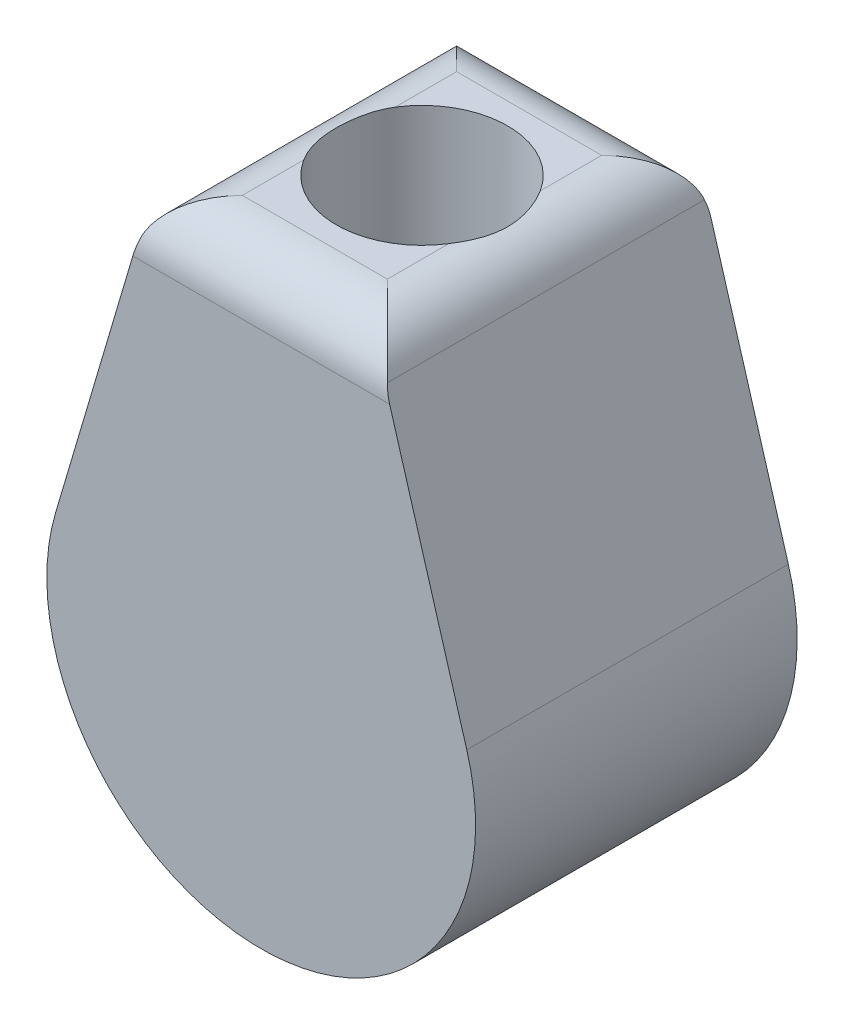
ISO-10303-21;
HEADER;
FILE_DESCRIPTION(('STEP AP214'),'2;1');
FILE_NAME('part.step','',(''),(''),'','','');
FILE_SCHEMA(('AUTOMOTIVE_DESIGN { 1 0 10303 214 1 1 1 1 }'));
ENDSEC;
DATA;
#1=APPLICATION_CONTEXT('core data for automotive mechanical design processes');
#2=APPLICATION_PROTOCOL_DEFINITION('international standard','automotive_design',2000,#1);
#3=PRODUCT_CONTEXT('',#1,'mechanical');
#4=PRODUCT('Part','Part','',(#3));
#5=PRODUCT_RELATED_PRODUCT_CATEGORY('part','',(#4));
#6=PRODUCT_DEFINITION_FORMATION('','',#4);
#7=PRODUCT_DEFINITION_CONTEXT('part definition',#1,'design');
#8=PRODUCT_DEFINITION('design','',#6,#7);
#9=PRODUCT_DEFINITION_SHAPE('','',#8);
#10=(LENGTH_UNIT() NAMED_UNIT(*) SI_UNIT(.MILLI.,.METRE.));
#11=(NAMED_UNIT(*) PLANE_ANGLE_UNIT() SI_UNIT($,.RADIAN.));
#12=(NAMED_UNIT(*) SI_UNIT($,.STERADIAN.) SOLID_ANGLE_UNIT());
#13=UNCERTAINTY_MEASURE_WITH_UNIT(LENGTH_MEASURE(1.E-05),#10,'distance_accuracy_value','');
#14=(GEOMETRIC_REPRESENTATION_CONTEXT(3) GLOBAL_UNCERTAINTY_ASSIGNED_CONTEXT((#13)) GLOBAL_UNIT_ASSIGNED_CONTEXT((#10,
#11,#12)) REPRESENTATION_CONTEXT('',''));
#15=CARTESIAN_POINT('',(0.,0.,0.));
#16=DIRECTION('',(0.,0.,1.));
#17=DIRECTION('',(1.,0.,0.));
#18=AXIS2_PLACEMENT_3D('',#15,#16,#17);
#19=CARTESIAN_POINT('',(1.6,0.,-6.));
#20=DIRECTION('',(0.,-1.,0.));
#21=DIRECTION('',(1.,0.,0.));
#22=AXIS2_PLACEMENT_3D('',#19,#20,#21);
#23=PLANE('',#22);
#24=DIRECTION('',(-1.,0.,0.));
#25=VECTOR('',#24,1.);
#26=CARTESIAN_POINT('',(2.1,0.,-5.));
#27=LINE('',#26,#25);
#28=CARTESIAN_POINT('',(-1.35305713878644,0.,-5.));
#29=VERTEX_POINT('',#28);
#30=CARTESIAN_POINT('',(1.35305713878644,0.,-5.));
#31=VERTEX_POINT('',#30);
#32=EDGE_CURVE('E182',#29,#31,#27,.F.);
#33=ORIENTED_EDGE('',*,*,#32,.F.);
#34=DIRECTION('',(0.,0.,1.));
#35=VECTOR('',#34,1.);
#36=CARTESIAN_POINT('',(-1.35305713878644,0.,-6.));
#37=LINE('',#36,#35);
#38=CARTESIAN_POINT('',(-1.35305713878644,0.,-3.85395338232193));
#39=VERTEX_POINT('',#38);
#40=EDGE_CURVE('E179',#39,#29,#37,.F.);
#41=ORIENTED_EDGE('',*,*,#40,.F.);
#42=CARTESIAN_POINT('',(0.,0.,-3.));
#43=DIRECTION('',(0.,1.,0.));
#44=DIRECTION('',(1.,0.,0.));
#45=AXIS2_PLACEMENT_3D('',#42,#43,#44);
#46=CIRCLE('',#45,1.6);
#47=CARTESIAN_POINT('',(1.35305713878644,0.,-3.85395338232193));
#48=VERTEX_POINT('',#47);
#49=EDGE_CURVE('E160',#48,#39,#46,.T.);
#50=ORIENTED_EDGE('',*,*,#49,.F.);
#51=DIRECTION('',(0.,0.,1.));
#52=VECTOR('',#51,1.);
#53=CARTESIAN_POINT('',(1.35305713878644,0.,-6.));
#54=LINE('',#53,#52);
#55=EDGE_CURVE('E184',#31,#48,#54,.T.);
#56=ORIENTED_EDGE('',*,*,#55,.F.);
#57=EDGE_LOOP('',(#33,#41,#50,#56));
#58=FACE_BOUND('',#57,.T.);
#59=ADVANCED_FACE('F43',(#58),#23,.F.);
#60=CARTESIAN_POINT('',(-1.6,-8.,-6.));
#61=DIRECTION('',(0.,-1.,0.));
#62=DIRECTION('',(0.,0.,1.));
#63=AXIS2_PLACEMENT_3D('',#60,#61,#62);
#64=PLANE('',#63);
#65=CARTESIAN_POINT('',(0.,-8.,-3.));
#66=DIRECTION('',(0.,-1.,0.));
#67=DIRECTION('',(0.,0.,-1.));
#68=AXIS2_PLACEMENT_3D('',#65,#66,#67);
#69=CIRCLE('',#68,1.6);
#70=CARTESIAN_POINT('',(0.,-8.,-4.6));
#71=VERTEX_POINT('',#70);
#72=EDGE_CURVE('E154',#71,#71,#69,.T.);
#73=ORIENTED_EDGE('',*,*,#72,.F.);
#74=EDGE_LOOP('',(#73));
#75=FACE_BOUND('',#74,.T.);
#76=ADVANCED_FACE('F221',(#75),#64,.F.);
#77=CARTESIAN_POINT('',(-2.1,0.,-6.));
#78=DIRECTION('',(0.958895343820342,-0.283759968282469,0.));
#79=DIRECTION('',(0.283759968282469,0.958895343820342,0.));
#80=AXIS2_PLACEMENT_3D('',#77,#78,#79);
#81=PLANE('',#80);
#82=DIRECTION('',(-0.283759968282469,-0.958895343820342,0.));
#83=VECTOR('',#82,1.);
#84=CARTESIAN_POINT('',(-2.1,0.,-6.));
#85=LINE('',#84,#83);
#86=CARTESIAN_POINT('',(-2.39592381495142,-0.999999999999999,-6.));
#87=VERTEX_POINT('',#86);
#88=CARTESIAN_POINT('',(-3.83558137528137,-5.86496012687012,-6.));
#89=VERTEX_POINT('',#88);
#90=EDGE_CURVE('E126',#87,#89,#85,.T.);
#91=ORIENTED_EDGE('',*,*,#90,.T.);
#92=DIRECTION('',(0.,0.,1.));
#93=VECTOR('',#92,1.);
#94=CARTESIAN_POINT('',(-3.83558137528137,-5.86496012687012,-6.));
#95=LINE('',#94,#93);
#96=CARTESIAN_POINT('',(-3.83558137528137,-5.86496012687012,0.));
#97=VERTEX_POINT('',#96);
#98=EDGE_CURVE('E134',#89,#97,#95,.T.);
#99=ORIENTED_EDGE('',*,*,#98,.T.);
#100=DIRECTION('',(-0.283759968282469,-0.958895343820342,0.));
#101=VECTOR('',#100,1.);
#102=CARTESIAN_POINT('',(-2.1,0.,0.));
#103=LINE('',#102,#101);
#104=CARTESIAN_POINT('',(-2.39592381495142,-1.,0.));
#105=VERTEX_POINT('',#104);
#106=EDGE_CURVE('E158',#105,#97,#103,.T.);
#107=ORIENTED_EDGE('',*,*,#106,.F.);
#108=CARTESIAN_POINT('',(-2.39592381495142,-1.,-1.));
#109=DIRECTION('',(-0.958895343820342,0.283759968282469,0.));
#110=DIRECTION('',(-0.283759968282469,-0.958895343820342,0.));
#111=AXIS2_PLACEMENT_3D('',#108,#109,#110);
#112=ELLIPSE('',#111,1.04286667616498,1.);
#113=CARTESIAN_POINT('',(-2.31195248260678,-0.716240031717531,-0.0411046561796576));
#114=VERTEX_POINT('',#113);
#115=EDGE_CURVE('E164',#114,#105,#112,.F.);
#116=ORIENTED_EDGE('',*,*,#115,.F.);
#117=DIRECTION('',(0.,0.,1.));
#118=VECTOR('',#117,1.);
#119=CARTESIAN_POINT('',(-2.31195248260678,-0.716240031717531,-6.));
#120=LINE('',#119,#118);
#121=CARTESIAN_POINT('',(-2.31195248260678,-0.716240031717531,-5.95889534382034));
#122=VERTEX_POINT('',#121);
#123=EDGE_CURVE('E167',#122,#114,#120,.T.);
#124=ORIENTED_EDGE('',*,*,#123,.F.);
#125=CARTESIAN_POINT('',(-2.39592381495142,-0.999999999999999,-5.));
#126=DIRECTION('',(-0.958895343820342,0.283759968282469,0.));
#127=DIRECTION('',(0.283759968282469,0.958895343820342,0.));
#128=AXIS2_PLACEMENT_3D('',#125,#126,#127);
#129=ELLIPSE('',#128,1.04286667616498,1.);
#130=EDGE_CURVE('E148',#87,#122,#129,.F.);
#131=ORIENTED_EDGE('',*,*,#130,.F.);
#132=EDGE_LOOP('',(#91,#99,#107,#116,#124,#131));
#133=FACE_BOUND('',#132,.T.);
#134=ADVANCED_FACE('F145',(#133),#81,.F.);
#135=CARTESIAN_POINT('',(0.,-7.,-6.));
#136=DIRECTION('',(0.,0.,1.));
#137=DIRECTION('',(-1.,0.,0.));
#138=AXIS2_PLACEMENT_3D('',#135,#136,#137);
#139=CYLINDRICAL_SURFACE('',#138,4.);
#140=CARTESIAN_POINT('',(0.,-7.,0.));
#141=DIRECTION('',(0.,0.,1.));
#142=DIRECTION('',(1.,0.,0.));
#143=AXIS2_PLACEMENT_3D('',#140,#141,#142);
#144=CIRCLE('',#143,4.);
#145=CARTESIAN_POINT('',(3.83558137528137,-5.86496012687012,0.));
#146=VERTEX_POINT('',#145);
#147=EDGE_CURVE('E137',#97,#146,#144,.T.);
#148=ORIENTED_EDGE('',*,*,#147,.F.);
#149=ORIENTED_EDGE('',*,*,#98,.F.);
#150=CARTESIAN_POINT('',(0.,-7.,-6.));
#151=DIRECTION('',(0.,0.,1.));
#152=DIRECTION('',(1.,0.,0.));
#153=AXIS2_PLACEMENT_3D('',#150,#151,#152);
#154=CIRCLE('',#153,4.);
#155=CARTESIAN_POINT('',(3.83558137528137,-5.86496012687012,-6.));
#156=VERTEX_POINT('',#155);
#157=EDGE_CURVE('E122',#89,#156,#154,.T.);
#158=ORIENTED_EDGE('',*,*,#157,.T.);
#159=DIRECTION('',(0.,0.,1.));
#160=VECTOR('',#159,1.);
#161=CARTESIAN_POINT('',(3.83558137528137,-5.86496012687012,-6.));
#162=LINE('',#161,#160);
#163=EDGE_CURVE('E142',#156,#146,#162,.T.);
#164=ORIENTED_EDGE('',*,*,#163,.T.);
#165=EDGE_LOOP('',(#148,#149,#158,#164));
#166=FACE_BOUND('',#165,.T.);
#167=ADVANCED_FACE('F135',(#166),#139,.T.);
#168=CARTESIAN_POINT('',(2.1,0.,-6.));
#169=DIRECTION('',(-0.958895343820342,-0.283759968282469,0.));
#170=DIRECTION('',(0.283759968282469,-0.958895343820342,0.));
#171=AXIS2_PLACEMENT_3D('',#168,#169,#170);
#172=PLANE('',#171);
#173=DIRECTION('',(0.,0.,1.));
#174=VECTOR('',#173,1.);
#175=CARTESIAN_POINT('',(2.31195248260678,-0.71624003171753,-6.));
#176=LINE('',#175,#174);
#177=CARTESIAN_POINT('',(2.31195248260678,-0.71624003171753,-0.0411046561796576));
#178=VERTEX_POINT('',#177);
#179=CARTESIAN_POINT('',(2.31195248260678,-0.71624003171753,-5.95889534382034));
#180=VERTEX_POINT('',#179);
#181=EDGE_CURVE('E189',#178,#180,#176,.F.);
#182=ORIENTED_EDGE('',*,*,#181,.F.);
#183=CARTESIAN_POINT('',(2.39592381495142,-1.,-1.));
#184=DIRECTION('',(0.958895343820342,0.283759968282469,0.));
#185=DIRECTION('',(-0.283759968282469,0.958895343820342,0.));
#186=AXIS2_PLACEMENT_3D('',#183,#184,#185);
#187=ELLIPSE('',#186,1.04286667616498,1.);
#188=CARTESIAN_POINT('',(2.39592381495142,-1.,0.));
#189=VERTEX_POINT('',#188);
#190=EDGE_CURVE('E187',#189,#178,#187,.F.);
#191=ORIENTED_EDGE('',*,*,#190,.F.);
#192=DIRECTION('',(-0.283759968282469,0.958895343820342,0.));
#193=VECTOR('',#192,1.);
#194=CARTESIAN_POINT('',(2.1,0.,0.));
#195=LINE('',#194,#193);
#196=EDGE_CURVE('E149',#146,#189,#195,.T.);
#197=ORIENTED_EDGE('',*,*,#196,.F.);
#198=ORIENTED_EDGE('',*,*,#163,.F.);
#199=DIRECTION('',(-0.283759968282469,0.958895343820342,0.));
#200=VECTOR('',#199,1.);
#201=CARTESIAN_POINT('',(2.1,0.,-6.));
#202=LINE('',#201,#200);
#203=CARTESIAN_POINT('',(2.39592381495142,-0.999999999999999,-6.));
#204=VERTEX_POINT('',#203);
#205=EDGE_CURVE('E128',#156,#204,#202,.T.);
#206=ORIENTED_EDGE('',*,*,#205,.T.);
#207=CARTESIAN_POINT('',(2.39592381495142,-0.999999999999999,-5.));
#208=DIRECTION('',(0.958895343820342,0.283759968282469,0.));
#209=DIRECTION('',(0.283759968282469,-0.958895343820342,0.));
#210=AXIS2_PLACEMENT_3D('',#207,#208,#209);
#211=ELLIPSE('',#210,1.04286667616498,1.);
#212=EDGE_CURVE('E191',#180,#204,#211,.F.);
#213=ORIENTED_EDGE('',*,*,#212,.F.);
#214=EDGE_LOOP('',(#182,#191,#197,#198,#206,#213));
#215=FACE_BOUND('',#214,.T.);
#216=ADVANCED_FACE('F227',(#215),#172,.F.);
#217=CARTESIAN_POINT('',(-1.35305713878644,0.,-2.14604661767807));
#218=VERTEX_POINT('',#217);
#219=CARTESIAN_POINT('',(1.35305713878644,0.,-2.14604661767807));
#220=VERTEX_POINT('',#219);
#221=EDGE_CURVE('E257',#218,#220,#46,.T.);
#222=ORIENTED_EDGE('',*,*,#221,.F.);
#223=DIRECTION('',(0.,0.,1.));
#224=VECTOR('',#223,1.);
#225=CARTESIAN_POINT('',(-1.35305713878644,0.,-6.));
#226=LINE('',#225,#224);
#227=CARTESIAN_POINT('',(-1.35305713878644,0.,-1.));
#228=VERTEX_POINT('',#227);
#229=EDGE_CURVE('E174',#228,#218,#226,.F.);
#230=ORIENTED_EDGE('',*,*,#229,.F.);
#231=DIRECTION('',(-1.,0.,0.));
#232=VECTOR('',#231,1.);
#233=CARTESIAN_POINT('',(1.6,0.,-1.));
#234=LINE('',#233,#232);
#235=CARTESIAN_POINT('',(1.35305713878644,0.,-1.));
#236=VERTEX_POINT('',#235);
#237=EDGE_CURVE('E171',#236,#228,#234,.T.);
#238=ORIENTED_EDGE('',*,*,#237,.F.);
#239=DIRECTION('',(0.,0.,1.));
#240=VECTOR('',#239,1.);
#241=CARTESIAN_POINT('',(1.35305713878644,0.,-6.));
#242=LINE('',#241,#240);
#243=EDGE_CURVE('E177',#220,#236,#242,.T.);
#244=ORIENTED_EDGE('',*,*,#243,.F.);
#245=EDGE_LOOP('',(#222,#230,#238,#244));
#246=FACE_BOUND('',#245,.T.);
#247=ADVANCED_FACE('F217',(#246),#23,.F.);
#248=CARTESIAN_POINT('',(0.,-7.,-6.));
#249=DIRECTION('',(0.,0.,-1.));
#250=DIRECTION('',(1.,0.,0.));
#251=AXIS2_PLACEMENT_3D('',#248,#249,#250);
#252=PLANE('',#251);
#253=ORIENTED_EDGE('',*,*,#205,.F.);
#254=ORIENTED_EDGE('',*,*,#157,.F.);
#255=ORIENTED_EDGE('',*,*,#90,.F.);
#256=DIRECTION('',(-1.,0.,0.));
#257=VECTOR('',#256,1.);
#258=CARTESIAN_POINT('',(-2.1,-0.999999999999999,-6.));
#259=LINE('',#258,#257);
#260=EDGE_CURVE('E141',#204,#87,#259,.T.);
#261=ORIENTED_EDGE('',*,*,#260,.F.);
#262=EDGE_LOOP('',(#253,#254,#255,#261));
#263=FACE_BOUND('',#262,.T.);
#264=ADVANCED_FACE('F124',(#263),#252,.T.);
#265=CARTESIAN_POINT('',(0.,-7.,0.));
#266=DIRECTION('',(0.,0.,-1.));
#267=DIRECTION('',(1.,0.,0.));
#268=AXIS2_PLACEMENT_3D('',#265,#266,#267);
#269=PLANE('',#268);
#270=ORIENTED_EDGE('',*,*,#106,.T.);
#271=ORIENTED_EDGE('',*,*,#147,.T.);
#272=ORIENTED_EDGE('',*,*,#196,.T.);
#273=DIRECTION('',(-1.,0.,0.));
#274=VECTOR('',#273,1.);
#275=CARTESIAN_POINT('',(0.,-0.999999999999999,0.));
#276=LINE('',#275,#274);
#277=EDGE_CURVE('E11',#105,#189,#276,.F.);
#278=ORIENTED_EDGE('',*,*,#277,.F.);
#279=EDGE_LOOP('',(#270,#271,#272,#278));
#280=FACE_BOUND('',#279,.T.);
#281=ADVANCED_FACE('F212',(#280),#269,.F.);
#282=CARTESIAN_POINT('',(0.,4.38634243989226,-3.));
#283=DIRECTION('',(0.,-1.,0.));
#284=DIRECTION('',(1.,0.,0.));
#285=AXIS2_PLACEMENT_3D('',#282,#283,#284);
#286=CYLINDRICAL_SURFACE('',#285,1.6);
#287=ORIENTED_EDGE('',*,*,#72,.T.);
#288=EDGE_LOOP('',(#287));
#289=FACE_BOUND('',#288,.T.);
#290=ORIENTED_EDGE('',*,*,#49,.T.);
#291=CARTESIAN_POINT('',(-1.35305713878644,0.,-2.14604661767807));
#292=CARTESIAN_POINT('',(-1.37570076684839,-9.53045621538372E-06,-2.18191839411649));
#293=CARTESIAN_POINT('',(-1.39690325497435,-0.000768999835214666,-2.21867998604224));
#294=CARTESIAN_POINT('',(-1.43630612484967,-0.00327337720027648,-2.29372981080483));
#295=CARTESIAN_POINT('',(-1.45450769550025,-0.00501789371318155,-2.33201743155932));
#296=CARTESIAN_POINT('',(-1.48781856953981,-0.00898011825730303,-2.40992209650369));
#297=CARTESIAN_POINT('',(-1.50292572784003,-0.0111981523766961,-2.44954004089661));
#298=CARTESIAN_POINT('',(-1.52994996539505,-0.0156756536905785,-2.52984003475307));
#299=CARTESIAN_POINT('',(-1.54186668252565,-0.0179351255572981,-2.57052220443446));
#300=CARTESIAN_POINT('',(-1.57363344648718,-0.0243736893075423,-2.6975140532573));
#301=CARTESIAN_POINT('',(-1.58800640288033,-0.0279663233590616,-2.785303918922));
#302=CARTESIAN_POINT('',(-1.60200351015844,-0.0314551515525887,-2.96203672031867));
#303=CARTESIAN_POINT('',(-1.6016377776277,-0.0313538811821458,-3.05097882324095));
#304=CARTESIAN_POINT('',(-1.58627621511469,-0.0275461471660554,-3.22687845890373));
#305=CARTESIAN_POINT('',(-1.57138010864585,-0.0238642582106822,-3.3138453857703));
#306=CARTESIAN_POINT('',(-1.52754259715676,-0.0150897084323437,-3.48407570744627));
#307=CARTESIAN_POINT('',(-1.49860837489121,-0.00999776964800421,-3.56734097249317));
#308=CARTESIAN_POINT('',(-1.4472665877008,-0.00432313828283832,-3.68333513020168));
#309=CARTESIAN_POINT('',(-1.43016476450946,-0.0028069553516254,-3.71843842241768));
#310=CARTESIAN_POINT('',(-1.39346474108047,-0.000648485603974057,-3.78725624318838));
#311=CARTESIAN_POINT('',(-1.37387128799555,-4.56341899608802E-06,-3.82097325536864));
#312=CARTESIAN_POINT('',(-1.35305713878644,0.,-3.85395338232193));
#313=B_SPLINE_CURVE_WITH_KNOTS('',3,(#291,#292,#293,#294,#295,#296,#297,#298,#299,#300,#301,
#302,#303,#304,#305,#306,#307,#308,#309,#310,#311,#312),.UNSPECIFIED.,.F.,.F.,(4,2,2,2,2,2,2,2,
2,2,4),(0.,0.127198127402648,0.254345739820157,0.381581196602571,0.508831088856911,
0.774544493581811,1.04007551666759,1.30379690204821,1.56738349358779,1.68451923399984,
1.80143505568337),.UNSPECIFIED.);
#314=EDGE_CURVE('E193',#218,#39,#313,.T.);
#315=ORIENTED_EDGE('',*,*,#314,.F.);
#316=ORIENTED_EDGE('',*,*,#221,.T.);
#317=CARTESIAN_POINT('',(1.35305713878644,0.,-3.85395338232193));
#318=CARTESIAN_POINT('',(1.37570076684839,-9.53045621501494E-06,-3.81808160588351));
#319=CARTESIAN_POINT('',(1.39690325497435,-0.000768999835214293,-3.78132001395776));
#320=CARTESIAN_POINT('',(1.43630612484967,-0.0032733772002761,-3.70627018919517));
#321=CARTESIAN_POINT('',(1.45450769550025,-0.00501789371318118,-3.66798256844068));
#322=CARTESIAN_POINT('',(1.48781856953981,-0.00898011825730259,-3.59007790349631));
#323=CARTESIAN_POINT('',(1.50292572784003,-0.0111981523766956,-3.55045995910339));
#324=CARTESIAN_POINT('',(1.52994996539505,-0.0156756536905779,-3.47015996524693));
#325=CARTESIAN_POINT('',(1.54186668252565,-0.0179351255572976,-3.42947779556554));
#326=CARTESIAN_POINT('',(1.57363344648718,-0.0243736893075418,-3.3024859467427));
#327=CARTESIAN_POINT('',(1.58800640288033,-0.027966323359061,-3.214696081078));
#328=CARTESIAN_POINT('',(1.60200351015844,-0.031455151552588,-3.03796327968133));
#329=CARTESIAN_POINT('',(1.6016377776277,-0.031353881182145,-2.94902117675904));
#330=CARTESIAN_POINT('',(1.58627621511468,-0.0275461471660546,-2.77312154109627));
#331=CARTESIAN_POINT('',(1.57138010864585,-0.0238642582106814,-2.6861546142297));
#332=CARTESIAN_POINT('',(1.52754259715676,-0.0150897084323428,-2.51592429255373));
#333=CARTESIAN_POINT('',(1.49860837489121,-0.00999776964800334,-2.43265902750683));
#334=CARTESIAN_POINT('',(1.4472665877008,-0.00432313828283756,-2.31666486979832));
#335=CARTESIAN_POINT('',(1.43016476450945,-0.0028069553516247,-2.28156157758232));
#336=CARTESIAN_POINT('',(1.39346474108047,-0.000648485603973461,-2.21274375681162));
#337=CARTESIAN_POINT('',(1.37387128799555,-4.56341899554579E-06,-2.17902674463136));
#338=CARTESIAN_POINT('',(1.35305713878644,0.,-2.14604661767807));
#339=B_SPLINE_CURVE_WITH_KNOTS('',3,(#317,#318,#319,#320,#321,#322,#323,#324,#325,#326,#327,
#328,#329,#330,#331,#332,#333,#334,#335,#336,#337,#338),.UNSPECIFIED.,.F.,.F.,(4,2,2,2,2,2,2,2,
2,2,4),(0.,0.127198127402648,0.254345739820157,0.381581196602572,0.508831088856912,
0.774544493581811,1.04007551666759,1.30379690204821,1.56738349358779,1.68451923399984,
1.80143505568336),.UNSPECIFIED.);
#340=EDGE_CURVE('E52',#48,#220,#339,.T.);
#341=ORIENTED_EDGE('',*,*,#340,.F.);
#342=EDGE_LOOP('',(#290,#315,#316,#341));
#343=FACE_BOUND('',#342,.T.);
#344=ADVANCED_FACE('F208',(#289,#343),#286,.F.);
#345=CARTESIAN_POINT('',(1.6,-1.,-1.));
#346=DIRECTION('',(-1.,0.,0.));
#347=DIRECTION('',(0.,-1.,0.));
#348=AXIS2_PLACEMENT_3D('',#345,#346,#347);
#349=CYLINDRICAL_SURFACE('',#348,1.);
#350=CARTESIAN_POINT('',(-1.35305713878644,-1.,-1.));
#351=DIRECTION('',(0.707106781186548,0.,0.707106781186547));
#352=DIRECTION('',(-0.707106781186548,0.,0.707106781186547));
#353=AXIS2_PLACEMENT_3D('',#350,#351,#352);
#354=ELLIPSE('',#353,1.41421356237309,1.);
#355=EDGE_CURVE('E260',#228,#114,#354,.T.);
#356=ORIENTED_EDGE('',*,*,#355,.T.);
#357=ORIENTED_EDGE('',*,*,#115,.T.);
#358=ORIENTED_EDGE('',*,*,#277,.T.);
#359=ORIENTED_EDGE('',*,*,#190,.T.);
#360=CARTESIAN_POINT('',(1.35305713878644,-1.,-1.));
#361=DIRECTION('',(0.707106781186548,0.,-0.707106781186547));
#362=DIRECTION('',(-0.707106781186548,0.,-0.707106781186547));
#363=AXIS2_PLACEMENT_3D('',#360,#361,#362);
#364=ELLIPSE('',#363,1.41421356237309,1.);
#365=EDGE_CURVE('E47',#178,#236,#364,.F.);
#366=ORIENTED_EDGE('',*,*,#365,.T.);
#367=ORIENTED_EDGE('',*,*,#237,.T.);
#368=EDGE_LOOP('',(#356,#357,#358,#359,#366,#367));
#369=FACE_BOUND('',#368,.T.);
#370=ADVANCED_FACE('F45',(#369),#349,.T.);
#371=CARTESIAN_POINT('',(1.35305713878644,-1.,-6.));
#372=DIRECTION('',(0.,0.,1.));
#373=DIRECTION('',(-1.,0.,0.));
#374=AXIS2_PLACEMENT_3D('',#371,#372,#373);
#375=CYLINDRICAL_SURFACE('',#374,1.);
#376=ORIENTED_EDGE('',*,*,#340,.T.);
#377=ORIENTED_EDGE('',*,*,#243,.T.);
#378=ORIENTED_EDGE('',*,*,#365,.F.);
#379=ORIENTED_EDGE('',*,*,#181,.T.);
#380=CARTESIAN_POINT('',(1.35305713878644,-0.999999999999999,-5.));
#381=DIRECTION('',(-0.707106781186548,0.,-0.707106781186547));
#382=DIRECTION('',(-0.707106781186548,0.,0.707106781186547));
#383=AXIS2_PLACEMENT_3D('',#380,#381,#382);
#384=ELLIPSE('',#383,1.41421356237309,1.);
#385=EDGE_CURVE('E60',#180,#31,#384,.F.);
#386=ORIENTED_EDGE('',*,*,#385,.T.);
#387=ORIENTED_EDGE('',*,*,#55,.T.);
#388=EDGE_LOOP('',(#376,#377,#378,#379,#386,#387));
#389=FACE_BOUND('',#388,.T.);
#390=ADVANCED_FACE('F240',(#389),#375,.T.);
#391=CARTESIAN_POINT('',(-1.35305713878644,-1.,-6.));
#392=DIRECTION('',(0.,0.,1.));
#393=DIRECTION('',(-1.,0.,0.));
#394=AXIS2_PLACEMENT_3D('',#391,#392,#393);
#395=CYLINDRICAL_SURFACE('',#394,1.);
#396=ORIENTED_EDGE('',*,*,#355,.F.);
#397=ORIENTED_EDGE('',*,*,#229,.T.);
#398=ORIENTED_EDGE('',*,*,#314,.T.);
#399=ORIENTED_EDGE('',*,*,#40,.T.);
#400=CARTESIAN_POINT('',(-1.35305713878644,-1.,-5.));
#401=DIRECTION('',(0.707106781186548,0.,-0.707106781186547));
#402=DIRECTION('',(0.707106781186548,0.,0.707106781186547));
#403=AXIS2_PLACEMENT_3D('',#400,#401,#402);
#404=ELLIPSE('',#403,1.41421356237309,1.);
#405=EDGE_CURVE('E250',#29,#122,#404,.F.);
#406=ORIENTED_EDGE('',*,*,#405,.T.);
#407=ORIENTED_EDGE('',*,*,#123,.T.);
#408=EDGE_LOOP('',(#396,#397,#398,#399,#406,#407));
#409=FACE_BOUND('',#408,.T.);
#410=ADVANCED_FACE('F205',(#409),#395,.T.);
#411=CARTESIAN_POINT('',(0.,-0.999999999999999,-5.));
#412=DIRECTION('',(1.,0.,0.));
#413=DIRECTION('',(0.,1.,0.));
#414=AXIS2_PLACEMENT_3D('',#411,#412,#413);
#415=CYLINDRICAL_SURFACE('',#414,1.);
#416=ORIENTED_EDGE('',*,*,#385,.F.);
#417=ORIENTED_EDGE('',*,*,#212,.T.);
#418=ORIENTED_EDGE('',*,*,#260,.T.);
#419=ORIENTED_EDGE('',*,*,#130,.T.);
#420=ORIENTED_EDGE('',*,*,#405,.F.);
#421=ORIENTED_EDGE('',*,*,#32,.T.);
#422=EDGE_LOOP('',(#416,#417,#418,#419,#420,#421));
#423=FACE_BOUND('',#422,.T.);
#424=ADVANCED_FACE('F235',(#423),#415,.T.);
#425=CLOSED_SHELL('',(#59,#76,#134,#167,#216,#247,#264,#281,#344,#370,#390,#410,#424));
#426=MANIFOLD_SOLID_BREP('B2',#425);
#427=ADVANCED_BREP_SHAPE_REPRESENTATION('',(#18,#426),#14);
#428=SHAPE_DEFINITION_REPRESENTATION(#9,#427);
ENDSEC;
END-ISO-10303-21;
